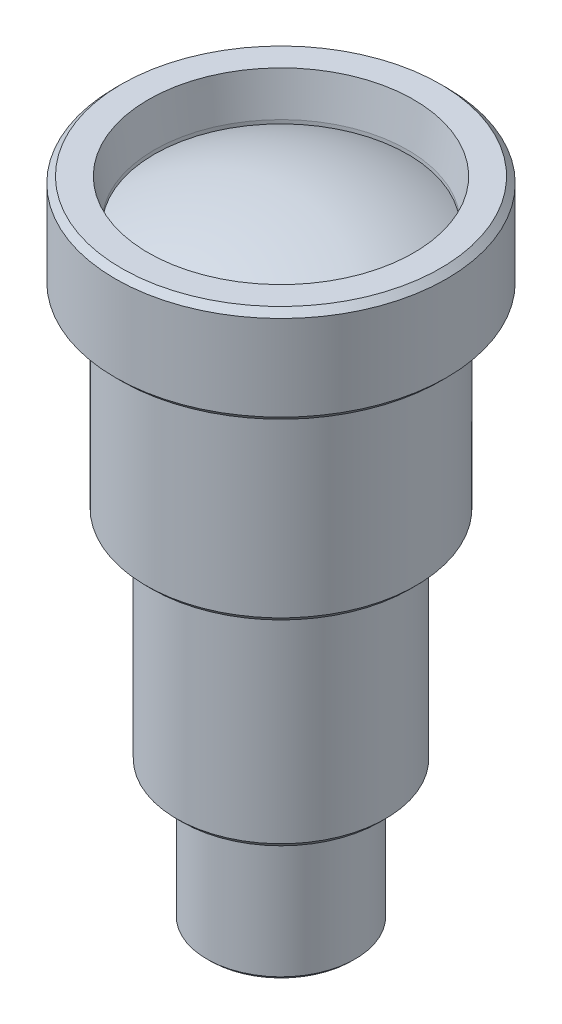
ISO-10303-21;
HEADER;
FILE_DESCRIPTION(('STEP AP214'),'2;1');
FILE_NAME('part.step','',(''),(''),'','','');
FILE_SCHEMA(('AUTOMOTIVE_DESIGN { 1 0 10303 214 1 1 1 1 }'));
ENDSEC;
DATA;
#1=APPLICATION_CONTEXT('core data for automotive mechanical design processes');
#2=APPLICATION_PROTOCOL_DEFINITION('international standard','automotive_design',2000,#1);
#3=PRODUCT_CONTEXT('',#1,'mechanical');
#4=PRODUCT('Part','Part','',(#3));
#5=PRODUCT_RELATED_PRODUCT_CATEGORY('part','',(#4));
#6=PRODUCT_DEFINITION_FORMATION('','',#4);
#7=PRODUCT_DEFINITION_CONTEXT('part definition',#1,'design');
#8=PRODUCT_DEFINITION('design','',#6,#7);
#9=PRODUCT_DEFINITION_SHAPE('','',#8);
#10=(LENGTH_UNIT() NAMED_UNIT(*) SI_UNIT(.MILLI.,.METRE.));
#11=(NAMED_UNIT(*) PLANE_ANGLE_UNIT() SI_UNIT($,.RADIAN.));
#12=(NAMED_UNIT(*) SI_UNIT($,.STERADIAN.) SOLID_ANGLE_UNIT());
#13=UNCERTAINTY_MEASURE_WITH_UNIT(LENGTH_MEASURE(1.E-05),#10,'distance_accuracy_value','');
#14=(GEOMETRIC_REPRESENTATION_CONTEXT(3) GLOBAL_UNCERTAINTY_ASSIGNED_CONTEXT((#13)) GLOBAL_UNIT_ASSIGNED_CONTEXT((#10,
#11,#12)) REPRESENTATION_CONTEXT('',''));
#15=CARTESIAN_POINT('',(0.,0.,0.));
#16=DIRECTION('',(0.,0.,1.));
#17=DIRECTION('',(1.,0.,0.));
#18=AXIS2_PLACEMENT_3D('',#15,#16,#17);
#19=CARTESIAN_POINT('',(49.7963038831455,120.776144187179,0.));
#20=DIRECTION('',(0.,1.,0.));
#21=DIRECTION('',(-1.,0.,0.));
#22=AXIS2_PLACEMENT_3D('',#19,#20,#21);
#23=CYLINDRICAL_SURFACE('',#22,10.3656198091898);
#24=CARTESIAN_POINT('',(49.7963038831455,118.146601070741,0.));
#25=DIRECTION('',(0.,1.,0.));
#26=DIRECTION('',(-1.,0.,0.));
#27=AXIS2_PLACEMENT_3D('',#24,#25,#26);
#28=CIRCLE('',#27,10.3656198091898);
#29=CARTESIAN_POINT('',(39.4306840739557,118.146601070741,0.));
#30=VERTEX_POINT('',#29);
#31=EDGE_CURVE('E11',#30,#30,#28,.T.);
#32=ORIENTED_EDGE('',*,*,#31,.F.);
#33=EDGE_LOOP('',(#32));
#34=FACE_BOUND('',#33,.T.);
#35=CARTESIAN_POINT('',(49.7963038831455,118.453284536166,0.));
#36=DIRECTION('',(0.,1.,0.));
#37=DIRECTION('',(-1.,0.,0.));
#38=AXIS2_PLACEMENT_3D('',#35,#36,#37);
#39=CIRCLE('',#38,10.3656198091898);
#40=CARTESIAN_POINT('',(39.4306840739557,118.453284536166,0.));
#41=VERTEX_POINT('',#40);
#42=EDGE_CURVE('E44',#41,#41,#39,.T.);
#43=ORIENTED_EDGE('',*,*,#42,.T.);
#44=EDGE_LOOP('',(#43));
#45=FACE_BOUND('',#44,.T.);
#46=ADVANCED_FACE('F38',(#34,#45),#23,.F.);
#47=CARTESIAN_POINT('',(49.7963038831455,118.453284536166,0.));
#48=DIRECTION('',(0.,1.,0.));
#49=DIRECTION('',(-1.,0.,0.));
#50=AXIS2_PLACEMENT_3D('',#47,#48,#49);
#51=CONICAL_SURFACE('',#50,10.3656198091898,0.150006778663949);
#52=CARTESIAN_POINT('',(49.7963038831455,121.764275545283,0.));
#53=DIRECTION('',(0.,1.,0.));
#54=DIRECTION('',(-1.,0.,0.));
#55=AXIS2_PLACEMENT_3D('',#52,#53,#54);
#56=CIRCLE('',#55,10.8660501141254);
#57=CARTESIAN_POINT('',(38.9302537690202,121.764275545283,0.));
#58=VERTEX_POINT('',#57);
#59=EDGE_CURVE('E140',#58,#58,#56,.T.);
#60=ORIENTED_EDGE('',*,*,#59,.T.);
#61=EDGE_LOOP('',(#60));
#62=FACE_BOUND('',#61,.T.);
#63=ORIENTED_EDGE('',*,*,#42,.F.);
#64=EDGE_LOOP('',(#63));
#65=FACE_BOUND('',#64,.T.);
#66=ADVANCED_FACE('F146',(#62,#65),#51,.F.);
#67=CARTESIAN_POINT('',(24.7494361644933,121.764275545283,0.));
#68=DIRECTION('',(0.,1.,0.));
#69=DIRECTION('',(-1.,0.,0.));
#70=AXIS2_PLACEMENT_3D('',#67,#68,#69);
#71=PLANE('',#70);
#72=CARTESIAN_POINT('',(49.7963038831455,121.764275545283,0.));
#73=DIRECTION('',(0.,1.,0.));
#74=DIRECTION('',(-1.,0.,0.));
#75=AXIS2_PLACEMENT_3D('',#72,#73,#74);
#76=CIRCLE('',#75,13.0591025630408);
#77=CARTESIAN_POINT('',(36.7372013201047,121.764275545283,0.));
#78=VERTEX_POINT('',#77);
#79=EDGE_CURVE('E137',#78,#78,#76,.T.);
#80=ORIENTED_EDGE('',*,*,#79,.T.);
#81=EDGE_LOOP('',(#80));
#82=FACE_BOUND('',#81,.T.);
#83=ORIENTED_EDGE('',*,*,#59,.F.);
#84=EDGE_LOOP('',(#83));
#85=FACE_BOUND('',#84,.T.);
#86=ADVANCED_FACE('F148',(#82,#85),#71,.T.);
#87=CARTESIAN_POINT('',(49.7963038831455,121.764275545283,0.));
#88=DIRECTION('',(0.,-1.,0.));
#89=DIRECTION('',(1.,0.,0.));
#90=AXIS2_PLACEMENT_3D('',#87,#88,#89);
#91=CONICAL_SURFACE('',#90,13.0591025630408,0.785283295687259);
#92=CARTESIAN_POINT('',(49.7963038831455,121.263717481781,0.));
#93=DIRECTION('',(0.,1.,0.));
#94=DIRECTION('',(-1.,0.,0.));
#95=AXIS2_PLACEMENT_3D('',#92,#93,#94);
#96=CIRCLE('',#95,13.559545643833);
#97=CARTESIAN_POINT('',(36.2367582393125,121.263717481781,0.));
#98=VERTEX_POINT('',#97);
#99=EDGE_CURVE('E134',#98,#98,#96,.T.);
#100=ORIENTED_EDGE('',*,*,#99,.T.);
#101=EDGE_LOOP('',(#100));
#102=FACE_BOUND('',#101,.T.);
#103=ORIENTED_EDGE('',*,*,#79,.F.);
#104=EDGE_LOOP('',(#103));
#105=FACE_BOUND('',#104,.T.);
#106=ADVANCED_FACE('F154',(#102,#105),#91,.T.);
#107=CARTESIAN_POINT('',(49.7963038831455,120.776144187179,0.));
#108=DIRECTION('',(0.,1.,0.));
#109=DIRECTION('',(-1.,0.,0.));
#110=AXIS2_PLACEMENT_3D('',#107,#108,#109);
#111=CYLINDRICAL_SURFACE('',#110,13.559545643833);
#112=CARTESIAN_POINT('',(49.7963038831455,114.268808207967,0.));
#113=DIRECTION('',(0.,1.,0.));
#114=DIRECTION('',(-1.,0.,0.));
#115=AXIS2_PLACEMENT_3D('',#112,#113,#114);
#116=CIRCLE('',#115,13.559545643833);
#117=CARTESIAN_POINT('',(36.2367582393125,114.268808207967,0.));
#118=VERTEX_POINT('',#117);
#119=EDGE_CURVE('E131',#118,#118,#116,.T.);
#120=ORIENTED_EDGE('',*,*,#119,.T.);
#121=EDGE_LOOP('',(#120));
#122=FACE_BOUND('',#121,.T.);
#123=ORIENTED_EDGE('',*,*,#99,.F.);
#124=EDGE_LOOP('',(#123));
#125=FACE_BOUND('',#124,.T.);
#126=ADVANCED_FACE('F161',(#122,#125),#111,.T.);
#127=CARTESIAN_POINT('',(49.7963038831455,114.268808207967,0.));
#128=DIRECTION('',(0.,1.,0.));
#129=DIRECTION('',(-1.,0.,0.));
#130=AXIS2_PLACEMENT_3D('',#127,#128,#129);
#131=CONICAL_SURFACE('',#130,13.559545643833,0.785283295687283);
#132=CARTESIAN_POINT('',(49.7963038831455,113.768250144465,0.));
#133=DIRECTION('',(0.,1.,0.));
#134=DIRECTION('',(-1.,0.,0.));
#135=AXIS2_PLACEMENT_3D('',#132,#133,#134);
#136=CIRCLE('',#135,13.0591025630408);
#137=CARTESIAN_POINT('',(36.7372013201047,113.768250144465,0.));
#138=VERTEX_POINT('',#137);
#139=EDGE_CURVE('E128',#138,#138,#136,.T.);
#140=ORIENTED_EDGE('',*,*,#139,.T.);
#141=EDGE_LOOP('',(#140));
#142=FACE_BOUND('',#141,.T.);
#143=ORIENTED_EDGE('',*,*,#119,.F.);
#144=EDGE_LOOP('',(#143));
#145=FACE_BOUND('',#144,.T.);
#146=ADVANCED_FACE('F165',(#142,#145),#131,.T.);
#147=CARTESIAN_POINT('',(24.7494361644933,113.768250144465,0.));
#148=DIRECTION('',(0.,-1.,0.));
#149=DIRECTION('',(1.,0.,0.));
#150=AXIS2_PLACEMENT_3D('',#147,#148,#149);
#151=PLANE('',#150);
#152=CARTESIAN_POINT('',(49.7963038831455,113.768250144465,0.));
#153=DIRECTION('',(0.,1.,0.));
#154=DIRECTION('',(-1.,0.,0.));
#155=AXIS2_PLACEMENT_3D('',#152,#153,#154);
#156=CIRCLE('',#155,12.1649714596142);
#157=CARTESIAN_POINT('',(37.6313324235313,113.768250144465,0.));
#158=VERTEX_POINT('',#157);
#159=EDGE_CURVE('E125',#158,#158,#156,.T.);
#160=ORIENTED_EDGE('',*,*,#159,.T.);
#161=EDGE_LOOP('',(#160));
#162=FACE_BOUND('',#161,.T.);
#163=ORIENTED_EDGE('',*,*,#139,.F.);
#164=EDGE_LOOP('',(#163));
#165=FACE_BOUND('',#164,.T.);
#166=ADVANCED_FACE('F169',(#162,#165),#151,.T.);
#167=CARTESIAN_POINT('',(49.7963038831455,120.776144187179,0.));
#168=DIRECTION('',(0.,1.,0.));
#169=DIRECTION('',(-1.,0.,0.));
#170=AXIS2_PLACEMENT_3D('',#167,#168,#169);
#171=CYLINDRICAL_SURFACE('',#170,12.1649714596142);
#172=ORIENTED_EDGE('',*,*,#159,.F.);
#173=EDGE_LOOP('',(#172));
#174=FACE_BOUND('',#173,.T.);
#175=CARTESIAN_POINT('',(49.7963038831455,118.154457249149,0.));
#176=DIRECTION('',(0.,1.,0.));
#177=DIRECTION('',(-1.,0.,0.));
#178=AXIS2_PLACEMENT_3D('',#175,#176,#177);
#179=CIRCLE('',#178,12.1649714596142);
#180=CARTESIAN_POINT('',(37.6313324235313,118.154457249149,0.));
#181=VERTEX_POINT('',#180);
#182=EDGE_CURVE('E122',#181,#181,#179,.T.);
#183=ORIENTED_EDGE('',*,*,#182,.T.);
#184=EDGE_LOOP('',(#183));
#185=FACE_BOUND('',#184,.T.);
#186=ADVANCED_FACE('F173',(#174,#185),#171,.F.);
#187=CARTESIAN_POINT('',(24.7494361644933,118.154457249149,0.));
#188=DIRECTION('',(0.,-1.,0.));
#189=DIRECTION('',(1.,0.,0.));
#190=AXIS2_PLACEMENT_3D('',#187,#188,#189);
#191=PLANE('',#190);
#192=CARTESIAN_POINT('',(49.7963038831455,118.154457249149,0.));
#193=DIRECTION('',(0.,1.,0.));
#194=DIRECTION('',(-1.,0.,0.));
#195=AXIS2_PLACEMENT_3D('',#192,#193,#194);
#196=CIRCLE('',#195,11.6645411546787);
#197=CARTESIAN_POINT('',(38.1317627284669,118.154457249149,0.));
#198=VERTEX_POINT('',#197);
#199=EDGE_CURVE('E119',#198,#198,#196,.T.);
#200=ORIENTED_EDGE('',*,*,#199,.T.);
#201=EDGE_LOOP('',(#200));
#202=FACE_BOUND('',#201,.T.);
#203=ORIENTED_EDGE('',*,*,#182,.F.);
#204=EDGE_LOOP('',(#203));
#205=FACE_BOUND('',#204,.T.);
#206=ADVANCED_FACE('F177',(#202,#205),#191,.T.);
#207=CARTESIAN_POINT('',(49.7963038831455,120.776144187179,0.));
#208=DIRECTION('',(0.,1.,0.));
#209=DIRECTION('',(-1.,0.,0.));
#210=AXIS2_PLACEMENT_3D('',#207,#208,#209);
#211=CYLINDRICAL_SURFACE('',#210,11.6645411546787);
#212=CARTESIAN_POINT('',(49.7963038831455,114.290271647137,0.));
#213=DIRECTION('',(0.,1.,0.));
#214=DIRECTION('',(-1.,0.,0.));
#215=AXIS2_PLACEMENT_3D('',#212,#213,#214);
#216=CIRCLE('',#215,11.6645411546787);
#217=CARTESIAN_POINT('',(38.1317627284669,114.290271647137,0.));
#218=VERTEX_POINT('',#217);
#219=EDGE_CURVE('E116',#218,#218,#216,.T.);
#220=ORIENTED_EDGE('',*,*,#219,.T.);
#221=EDGE_LOOP('',(#220));
#222=FACE_BOUND('',#221,.T.);
#223=ORIENTED_EDGE('',*,*,#199,.F.);
#224=EDGE_LOOP('',(#223));
#225=FACE_BOUND('',#224,.T.);
#226=ADVANCED_FACE('F181',(#222,#225),#211,.T.);
#227=CARTESIAN_POINT('',(49.7963038831455,114.290271647137,0.));
#228=DIRECTION('',(0.,1.,0.));
#229=DIRECTION('',(-1.,0.,0.));
#230=AXIS2_PLACEMENT_3D('',#227,#228,#229);
#231=CONICAL_SURFACE('',#230,11.6645411546787,0.958673813778408);
#232=CARTESIAN_POINT('',(49.7963038831455,113.863941310765,0.));
#233=DIRECTION('',(0.,1.,0.));
#234=DIRECTION('',(-1.,0.,0.));
#235=AXIS2_PLACEMENT_3D('',#232,#233,#234);
#236=CIRCLE('',#235,11.0573046881587);
#237=CARTESIAN_POINT('',(38.7389991949868,113.863941310765,0.));
#238=VERTEX_POINT('',#237);
#239=EDGE_CURVE('E113',#238,#238,#236,.T.);
#240=ORIENTED_EDGE('',*,*,#239,.T.);
#241=EDGE_LOOP('',(#240));
#242=FACE_BOUND('',#241,.T.);
#243=ORIENTED_EDGE('',*,*,#219,.F.);
#244=EDGE_LOOP('',(#243));
#245=FACE_BOUND('',#244,.T.);
#246=ADVANCED_FACE('F185',(#242,#245),#231,.T.);
#247=CARTESIAN_POINT('',(49.7963038831455,120.776144187179,0.));
#248=DIRECTION('',(0.,1.,0.));
#249=DIRECTION('',(-1.,0.,0.));
#250=AXIS2_PLACEMENT_3D('',#247,#248,#249);
#251=CYLINDRICAL_SURFACE('',#250,11.0573046881587);
#252=CARTESIAN_POINT('',(49.7963038831455,98.2670477552795,0.));
#253=DIRECTION('',(0.,1.,0.));
#254=DIRECTION('',(-1.,0.,0.));
#255=AXIS2_PLACEMENT_3D('',#252,#253,#254);
#256=CIRCLE('',#255,11.0573046881587);
#257=CARTESIAN_POINT('',(38.7389991949868,98.2670477552795,0.));
#258=VERTEX_POINT('',#257);
#259=EDGE_CURVE('E110',#258,#258,#256,.T.);
#260=ORIENTED_EDGE('',*,*,#259,.T.);
#261=EDGE_LOOP('',(#260));
#262=FACE_BOUND('',#261,.T.);
#263=ORIENTED_EDGE('',*,*,#239,.F.);
#264=EDGE_LOOP('',(#263));
#265=FACE_BOUND('',#264,.T.);
#266=ADVANCED_FACE('F189',(#262,#265),#251,.T.);
#267=CARTESIAN_POINT('',(49.7963038831455,98.2670477552795,0.));
#268=DIRECTION('',(0.,1.,0.));
#269=DIRECTION('',(-1.,0.,0.));
#270=AXIS2_PLACEMENT_3D('',#267,#268,#269);
#271=CONICAL_SURFACE('',#270,11.0573046881587,0.785398163397448);
#272=CARTESIAN_POINT('',(49.7963038831455,97.766617450344,0.));
#273=DIRECTION('',(0.,1.,0.));
#274=DIRECTION('',(-1.,0.,0.));
#275=AXIS2_PLACEMENT_3D('',#272,#273,#274);
#276=CIRCLE('',#275,10.5568743832231);
#277=CARTESIAN_POINT('',(39.2394294999224,97.766617450344,0.));
#278=VERTEX_POINT('',#277);
#279=EDGE_CURVE('E107',#278,#278,#276,.T.);
#280=ORIENTED_EDGE('',*,*,#279,.T.);
#281=EDGE_LOOP('',(#280));
#282=FACE_BOUND('',#281,.T.);
#283=ORIENTED_EDGE('',*,*,#259,.F.);
#284=EDGE_LOOP('',(#283));
#285=FACE_BOUND('',#284,.T.);
#286=ADVANCED_FACE('F193',(#282,#285),#271,.T.);
#287=CARTESIAN_POINT('',(24.7494361644933,97.766617450344,0.));
#288=DIRECTION('',(0.,1.,0.));
#289=DIRECTION('',(-1.,0.,0.));
#290=AXIS2_PLACEMENT_3D('',#287,#288,#289);
#291=PLANE('',#290);
#292=ORIENTED_EDGE('',*,*,#279,.F.);
#293=EDGE_LOOP('',(#292));
#294=FACE_BOUND('',#293,.T.);
#295=CARTESIAN_POINT('',(49.7963038831455,97.766617450344,0.));
#296=DIRECTION('',(0.,1.,0.));
#297=DIRECTION('',(-1.,0.,0.));
#298=AXIS2_PLACEMENT_3D('',#295,#296,#297);
#299=CIRCLE('',#298,8.55579195631336);
#300=CARTESIAN_POINT('',(41.2405119268322,97.766617450344,0.));
#301=VERTEX_POINT('',#300);
#302=EDGE_CURVE('E104',#301,#301,#299,.T.);
#303=ORIENTED_EDGE('',*,*,#302,.T.);
#304=EDGE_LOOP('',(#303));
#305=FACE_BOUND('',#304,.T.);
#306=ADVANCED_FACE('F197',(#294,#305),#291,.F.);
#307=CARTESIAN_POINT('',(49.7963038831455,120.776144187179,0.));
#308=DIRECTION('',(0.,1.,0.));
#309=DIRECTION('',(-1.,0.,0.));
#310=AXIS2_PLACEMENT_3D('',#307,#308,#309);
#311=CYLINDRICAL_SURFACE('',#310,8.55579195631336);
#312=ORIENTED_EDGE('',*,*,#302,.F.);
#313=EDGE_LOOP('',(#312));
#314=FACE_BOUND('',#313,.T.);
#315=CARTESIAN_POINT('',(49.7963038831455,80.4875268499039,0.));
#316=DIRECTION('',(0.,1.,0.));
#317=DIRECTION('',(-1.,0.,0.));
#318=AXIS2_PLACEMENT_3D('',#315,#316,#317);
#319=CIRCLE('',#318,8.55579195631336);
#320=CARTESIAN_POINT('',(41.2405119268322,80.4875268499039,0.));
#321=VERTEX_POINT('',#320);
#322=EDGE_CURVE('E101',#321,#321,#319,.T.);
#323=ORIENTED_EDGE('',*,*,#322,.T.);
#324=EDGE_LOOP('',(#323));
#325=FACE_BOUND('',#324,.T.);
#326=ADVANCED_FACE('F201',(#314,#325),#311,.T.);
#327=CARTESIAN_POINT('',(49.7963038831455,80.4875268499039,0.));
#328=DIRECTION('',(0.,1.,0.));
#329=DIRECTION('',(-1.,0.,0.));
#330=AXIS2_PLACEMENT_3D('',#327,#328,#329);
#331=CONICAL_SURFACE('',#330,8.55579195631336,0.785270530979511);
#332=CARTESIAN_POINT('',(49.7963038831455,79.9869687864018,0.));
#333=DIRECTION('',(0.,1.,0.));
#334=DIRECTION('',(-1.,0.,0.));
#335=AXIS2_PLACEMENT_3D('',#332,#333,#334);
#336=CIRCLE('',#335,8.0553616513778);
#337=CARTESIAN_POINT('',(41.7409422317677,79.9869687864018,0.));
#338=VERTEX_POINT('',#337);
#339=EDGE_CURVE('E98',#338,#338,#336,.T.);
#340=ORIENTED_EDGE('',*,*,#339,.T.);
#341=EDGE_LOOP('',(#340));
#342=FACE_BOUND('',#341,.T.);
#343=ORIENTED_EDGE('',*,*,#322,.F.);
#344=EDGE_LOOP('',(#343));
#345=FACE_BOUND('',#344,.T.);
#346=ADVANCED_FACE('F205',(#342,#345),#331,.T.);
#347=CARTESIAN_POINT('',(24.7494361644933,79.9869687864018,0.));
#348=DIRECTION('',(0.,-1.,0.));
#349=DIRECTION('',(1.,0.,0.));
#350=AXIS2_PLACEMENT_3D('',#347,#348,#349);
#351=PLANE('',#350);
#352=CARTESIAN_POINT('',(49.7963038831455,79.9869687864018,0.));
#353=DIRECTION('',(0.,1.,0.));
#354=DIRECTION('',(-1.,0.,0.));
#355=AXIS2_PLACEMENT_3D('',#352,#353,#354);
#356=CIRCLE('',#355,5.60648544892575);
#357=CARTESIAN_POINT('',(44.1898184342198,79.9869687864018,0.));
#358=VERTEX_POINT('',#357);
#359=EDGE_CURVE('E95',#358,#358,#356,.T.);
#360=ORIENTED_EDGE('',*,*,#359,.T.);
#361=EDGE_LOOP('',(#360));
#362=FACE_BOUND('',#361,.T.);
#363=ORIENTED_EDGE('',*,*,#339,.F.);
#364=EDGE_LOOP('',(#363));
#365=FACE_BOUND('',#364,.T.);
#366=ADVANCED_FACE('F209',(#362,#365),#351,.T.);
#367=CARTESIAN_POINT('',(49.7963038831455,120.776144187179,0.));
#368=DIRECTION('',(0.,1.,0.));
#369=DIRECTION('',(-1.,0.,0.));
#370=AXIS2_PLACEMENT_3D('',#367,#368,#369);
#371=CYLINDRICAL_SURFACE('',#370,5.60648544892575);
#372=CARTESIAN_POINT('',(49.7963038831455,79.1884777458485,0.));
#373=DIRECTION('',(0.,1.,0.));
#374=DIRECTION('',(-1.,0.,0.));
#375=AXIS2_PLACEMENT_3D('',#372,#373,#374);
#376=CIRCLE('',#375,5.60648544892575);
#377=CARTESIAN_POINT('',(44.1898184342198,79.1884777458485,0.));
#378=VERTEX_POINT('',#377);
#379=EDGE_CURVE('E92',#378,#378,#376,.T.);
#380=ORIENTED_EDGE('',*,*,#379,.T.);
#381=EDGE_LOOP('',(#380));
#382=FACE_BOUND('',#381,.T.);
#383=ORIENTED_EDGE('',*,*,#359,.F.);
#384=EDGE_LOOP('',(#383));
#385=FACE_BOUND('',#384,.T.);
#386=ADVANCED_FACE('F213',(#382,#385),#371,.T.);
#387=CARTESIAN_POINT('',(24.7494361644933,79.1884777458485,0.));
#388=DIRECTION('',(0.,1.,0.));
#389=DIRECTION('',(-1.,0.,0.));
#390=AXIS2_PLACEMENT_3D('',#387,#388,#389);
#391=PLANE('',#390);
#392=CARTESIAN_POINT('',(49.7963038831455,79.1884777458485,0.));
#393=DIRECTION('',(0.,1.,0.));
#394=DIRECTION('',(-1.,0.,0.));
#395=AXIS2_PLACEMENT_3D('',#392,#393,#394);
#396=CIRCLE('',#395,5.75545193745137);
#397=CARTESIAN_POINT('',(44.0408519456942,79.1884777458485,0.));
#398=VERTEX_POINT('',#397);
#399=EDGE_CURVE('E89',#398,#398,#396,.T.);
#400=ORIENTED_EDGE('',*,*,#399,.T.);
#401=EDGE_LOOP('',(#400));
#402=FACE_BOUND('',#401,.T.);
#403=ORIENTED_EDGE('',*,*,#379,.F.);
#404=EDGE_LOOP('',(#403));
#405=FACE_BOUND('',#404,.T.);
#406=ADVANCED_FACE('F217',(#402,#405),#391,.T.);
#407=CARTESIAN_POINT('',(49.7963038831455,79.1884777458485,0.));
#408=DIRECTION('',(0.,-1.,0.));
#409=DIRECTION('',(1.,0.,0.));
#410=AXIS2_PLACEMENT_3D('',#407,#408,#409);
#411=CONICAL_SURFACE('',#410,5.75545193745137,0.803087977590895);
#412=CARTESIAN_POINT('',(49.7963038831455,78.8905447687973,0.));
#413=DIRECTION('',(0.,1.,0.));
#414=DIRECTION('',(-1.,0.,0.));
#415=AXIS2_PLACEMENT_3D('',#412,#413,#414);
#416=CIRCLE('',#415,6.06411663408764);
#417=CARTESIAN_POINT('',(43.7321872490579,78.8905447687973,0.));
#418=VERTEX_POINT('',#417);
#419=EDGE_CURVE('E86',#418,#418,#416,.T.);
#420=ORIENTED_EDGE('',*,*,#419,.T.);
#421=EDGE_LOOP('',(#420));
#422=FACE_BOUND('',#421,.T.);
#423=ORIENTED_EDGE('',*,*,#399,.F.);
#424=EDGE_LOOP('',(#423));
#425=FACE_BOUND('',#424,.T.);
#426=ADVANCED_FACE('F221',(#422,#425),#411,.T.);
#427=CARTESIAN_POINT('',(49.7963038831455,120.776144187179,0.));
#428=DIRECTION('',(0.,1.,0.));
#429=DIRECTION('',(-1.,0.,0.));
#430=AXIS2_PLACEMENT_3D('',#427,#428,#429);
#431=CYLINDRICAL_SURFACE('',#430,6.06411663408764);
#432=CARTESIAN_POINT('',(49.7963038831455,69.2870610844213,0.));
#433=DIRECTION('',(0.,1.,0.));
#434=DIRECTION('',(-1.,0.,0.));
#435=AXIS2_PLACEMENT_3D('',#432,#433,#434);
#436=CIRCLE('',#435,6.06411663408764);
#437=CARTESIAN_POINT('',(43.7321872490579,69.2870610844213,0.));
#438=VERTEX_POINT('',#437);
#439=EDGE_CURVE('E83',#438,#438,#436,.T.);
#440=ORIENTED_EDGE('',*,*,#439,.T.);
#441=EDGE_LOOP('',(#440));
#442=FACE_BOUND('',#441,.T.);
#443=ORIENTED_EDGE('',*,*,#419,.F.);
#444=EDGE_LOOP('',(#443));
#445=FACE_BOUND('',#444,.T.);
#446=ADVANCED_FACE('F225',(#442,#445),#431,.T.);
#447=CARTESIAN_POINT('',(49.7963038831455,69.2870610844213,0.));
#448=DIRECTION('',(0.,1.,0.));
#449=DIRECTION('',(-1.,0.,0.));
#450=AXIS2_PLACEMENT_3D('',#447,#448,#449);
#451=CONICAL_SURFACE('',#450,6.06411663408765,0.802873747844111);
#452=CARTESIAN_POINT('',(49.7963038831455,68.9890003488036,0.));
#453=DIRECTION('',(0.,1.,0.));
#454=DIRECTION('',(-1.,0.,0.));
#455=AXIS2_PLACEMENT_3D('',#452,#453,#454);
#456=CIRCLE('',#455,5.75545193745137);
#457=CARTESIAN_POINT('',(44.0408519456942,68.9890003488036,0.));
#458=VERTEX_POINT('',#457);
#459=EDGE_CURVE('E80',#458,#458,#456,.T.);
#460=ORIENTED_EDGE('',*,*,#459,.T.);
#461=EDGE_LOOP('',(#460));
#462=FACE_BOUND('',#461,.T.);
#463=ORIENTED_EDGE('',*,*,#439,.F.);
#464=EDGE_LOOP('',(#463));
#465=FACE_BOUND('',#464,.T.);
#466=ADVANCED_FACE('F229',(#462,#465),#451,.T.);
#467=CARTESIAN_POINT('',(24.7494361644933,68.9890003488036,0.));
#468=DIRECTION('',(0.,-1.,0.));
#469=DIRECTION('',(1.,0.,0.));
#470=AXIS2_PLACEMENT_3D('',#467,#468,#469);
#471=PLANE('',#470);
#472=CARTESIAN_POINT('',(49.7963038831455,68.9890003488036,0.));
#473=DIRECTION('',(0.,1.,0.));
#474=DIRECTION('',(-1.,0.,0.));
#475=AXIS2_PLACEMENT_3D('',#472,#473,#474);
#476=CIRCLE('',#475,5.10605514399019);
#477=CARTESIAN_POINT('',(44.6902487391553,68.9890003488036,0.));
#478=VERTEX_POINT('',#477);
#479=EDGE_CURVE('E77',#478,#478,#476,.T.);
#480=ORIENTED_EDGE('',*,*,#479,.T.);
#481=EDGE_LOOP('',(#480));
#482=FACE_BOUND('',#481,.T.);
#483=ORIENTED_EDGE('',*,*,#459,.F.);
#484=EDGE_LOOP('',(#483));
#485=FACE_BOUND('',#484,.T.);
#486=ADVANCED_FACE('F233',(#482,#485),#471,.T.);
#487=CARTESIAN_POINT('',(49.7963038831455,120.776144187179,0.));
#488=DIRECTION('',(0.,1.,0.));
#489=DIRECTION('',(-1.,0.,0.));
#490=AXIS2_PLACEMENT_3D('',#487,#488,#489);
#491=CYLINDRICAL_SURFACE('',#490,5.10605514399019);
#492=ORIENTED_EDGE('',*,*,#479,.F.);
#493=EDGE_LOOP('',(#492));
#494=FACE_BOUND('',#493,.T.);
#495=CARTESIAN_POINT('',(49.7963038831455,80.4875268499039,0.));
#496=DIRECTION('',(0.,1.,0.));
#497=DIRECTION('',(-1.,0.,0.));
#498=AXIS2_PLACEMENT_3D('',#495,#496,#497);
#499=CIRCLE('',#498,5.10605514399019);
#500=CARTESIAN_POINT('',(44.6902487391553,80.4875268499039,0.));
#501=VERTEX_POINT('',#500);
#502=EDGE_CURVE('E74',#501,#501,#499,.T.);
#503=ORIENTED_EDGE('',*,*,#502,.T.);
#504=EDGE_LOOP('',(#503));
#505=FACE_BOUND('',#504,.T.);
#506=ADVANCED_FACE('F237',(#494,#505),#491,.F.);
#507=CARTESIAN_POINT('',(24.7494361644933,80.4875268499039,0.));
#508=DIRECTION('',(0.,-1.,0.));
#509=DIRECTION('',(1.,0.,0.));
#510=AXIS2_PLACEMENT_3D('',#507,#508,#509);
#511=PLANE('',#510);
#512=ORIENTED_EDGE('',*,*,#502,.F.);
#513=EDGE_LOOP('',(#512));
#514=FACE_BOUND('',#513,.T.);
#515=CARTESIAN_POINT('',(49.7963038831455,80.4875268499039,0.));
#516=DIRECTION('',(0.,1.,0.));
#517=DIRECTION('',(-1.,0.,0.));
#518=AXIS2_PLACEMENT_3D('',#515,#516,#517);
#519=CIRCLE('',#518,7.55493134644225);
#520=CARTESIAN_POINT('',(42.2413725367033,80.4875268499039,0.));
#521=VERTEX_POINT('',#520);
#522=EDGE_CURVE('E71',#521,#521,#519,.T.);
#523=ORIENTED_EDGE('',*,*,#522,.T.);
#524=EDGE_LOOP('',(#523));
#525=FACE_BOUND('',#524,.T.);
#526=ADVANCED_FACE('F241',(#514,#525),#511,.F.);
#527=CARTESIAN_POINT('',(49.7963038831455,120.776144187179,0.));
#528=DIRECTION('',(0.,1.,0.));
#529=DIRECTION('',(-1.,0.,0.));
#530=AXIS2_PLACEMENT_3D('',#527,#528,#529);
#531=CYLINDRICAL_SURFACE('',#530,7.55493134644225);
#532=ORIENTED_EDGE('',*,*,#522,.F.);
#533=EDGE_LOOP('',(#532));
#534=FACE_BOUND('',#533,.T.);
#535=CARTESIAN_POINT('',(49.7963038831455,99.4065264097907,0.));
#536=DIRECTION('',(0.,1.,0.));
#537=DIRECTION('',(-1.,0.,0.));
#538=AXIS2_PLACEMENT_3D('',#535,#536,#537);
#539=CIRCLE('',#538,7.55493134644225);
#540=CARTESIAN_POINT('',(42.2413725367033,99.4065264097907,0.));
#541=VERTEX_POINT('',#540);
#542=EDGE_CURVE('E68',#541,#541,#539,.T.);
#543=ORIENTED_EDGE('',*,*,#542,.T.);
#544=EDGE_LOOP('',(#543));
#545=FACE_BOUND('',#544,.T.);
#546=ADVANCED_FACE('F245',(#534,#545),#531,.F.);
#547=CARTESIAN_POINT('',(24.7494361644933,99.4065264097907,0.));
#548=DIRECTION('',(0.,-1.,0.));
#549=DIRECTION('',(1.,0.,0.));
#550=AXIS2_PLACEMENT_3D('',#547,#548,#549);
#551=PLANE('',#550);
#552=ORIENTED_EDGE('',*,*,#542,.F.);
#553=EDGE_LOOP('',(#552));
#554=FACE_BOUND('',#553,.T.);
#555=CARTESIAN_POINT('',(49.7963038831455,99.4065264097907,0.));
#556=DIRECTION('',(0.,1.,0.));
#557=DIRECTION('',(-1.,0.,0.));
#558=AXIS2_PLACEMENT_3D('',#555,#556,#557);
#559=CIRCLE('',#558,9.96075291198767);
#560=CARTESIAN_POINT('',(39.8355509711579,99.4065264097907,0.));
#561=VERTEX_POINT('',#560);
#562=EDGE_CURVE('E65',#561,#561,#559,.T.);
#563=ORIENTED_EDGE('',*,*,#562,.T.);
#564=EDGE_LOOP('',(#563));
#565=FACE_BOUND('',#564,.T.);
#566=ADVANCED_FACE('F249',(#554,#565),#551,.F.);
#567=CARTESIAN_POINT('',(49.7963038831455,120.776144187179,0.));
#568=DIRECTION('',(0.,1.,0.));
#569=DIRECTION('',(-1.,0.,0.));
#570=AXIS2_PLACEMENT_3D('',#567,#568,#569);
#571=CYLINDRICAL_SURFACE('',#570,9.96075291198767);
#572=ORIENTED_EDGE('',*,*,#562,.F.);
#573=EDGE_LOOP('',(#572));
#574=FACE_BOUND('',#573,.T.);
#575=CARTESIAN_POINT('',(49.7963038831455,114.769238512903,0.));
#576=DIRECTION('',(0.,1.,0.));
#577=DIRECTION('',(-1.,0.,0.));
#578=AXIS2_PLACEMENT_3D('',#575,#576,#577);
#579=CIRCLE('',#578,9.96075291198767);
#580=CARTESIAN_POINT('',(39.8355509711579,114.769238512903,0.));
#581=VERTEX_POINT('',#580);
#582=EDGE_CURVE('E60',#581,#581,#579,.T.);
#583=ORIENTED_EDGE('',*,*,#582,.T.);
#584=EDGE_LOOP('',(#583));
#585=FACE_BOUND('',#584,.T.);
#586=ADVANCED_FACE('F253',(#574,#585),#571,.F.);
#587=CARTESIAN_POINT('',(24.7494361644933,114.769238512903,0.));
#588=DIRECTION('',(0.,-1.,0.));
#589=DIRECTION('',(1.,0.,0.));
#590=AXIS2_PLACEMENT_3D('',#587,#588,#589);
#591=PLANE('',#590);
#592=ORIENTED_EDGE('',*,*,#582,.F.);
#593=EDGE_LOOP('',(#592));
#594=FACE_BOUND('',#593,.T.);
#595=CARTESIAN_POINT('',(49.7963038831455,114.769238512903,0.));
#596=DIRECTION('',(0.,1.,0.));
#597=DIRECTION('',(-1.,0.,0.));
#598=AXIS2_PLACEMENT_3D('',#595,#596,#597);
#599=CIRCLE('',#598,10.6636805448075);
#600=CARTESIAN_POINT('',(39.132623338338,114.769238512903,0.));
#601=VERTEX_POINT('',#600);
#602=EDGE_CURVE('E57',#601,#601,#599,.T.);
#603=ORIENTED_EDGE('',*,*,#602,.T.);
#604=EDGE_LOOP('',(#603));
#605=FACE_BOUND('',#604,.T.);
#606=ADVANCED_FACE('F257',(#594,#605),#591,.F.);
#607=CARTESIAN_POINT('',(49.7963038831455,120.776144187179,0.));
#608=DIRECTION('',(0.,1.,0.));
#609=DIRECTION('',(-1.,0.,0.));
#610=AXIS2_PLACEMENT_3D('',#607,#608,#609);
#611=CYLINDRICAL_SURFACE('',#610,10.6636805448075);
#612=ORIENTED_EDGE('',*,*,#602,.F.);
#613=EDGE_LOOP('',(#612));
#614=FACE_BOUND('',#613,.T.);
#615=CARTESIAN_POINT('',(49.7963038831455,117.981943435398,0.));
#616=DIRECTION('',(0.,1.,0.));
#617=DIRECTION('',(-1.,0.,0.));
#618=AXIS2_PLACEMENT_3D('',#615,#616,#617);
#619=CIRCLE('',#618,10.6636805448075);
#620=CARTESIAN_POINT('',(39.132623338338,117.981943435398,0.));
#621=VERTEX_POINT('',#620);
#622=EDGE_CURVE('E55',#621,#621,#619,.T.);
#623=ORIENTED_EDGE('',*,*,#622,.T.);
#624=EDGE_LOOP('',(#623));
#625=FACE_BOUND('',#624,.T.);
#626=ADVANCED_FACE('F51',(#614,#625),#611,.F.);
#627=CARTESIAN_POINT('',(49.7963038831455,117.981943435398,0.));
#628=DIRECTION('',(0.,-1.,0.));
#629=DIRECTION('',(1.,0.,0.));
#630=AXIS2_PLACEMENT_3D('',#627,#628,#629);
#631=CONICAL_SURFACE('',#630,10.6636805448075,1.38850446067506);
#632=CARTESIAN_POINT('',(49.7963038831455,119.94766793936,0.));
#633=VERTEX_POINT('',#632);
#634=VERTEX_LOOP('',#633);
#635=FACE_BOUND('',#634,.T.);
#636=ORIENTED_EDGE('',*,*,#622,.F.);
#637=EDGE_LOOP('',(#636));
#638=FACE_BOUND('',#637,.T.);
#639=ADVANCED_FACE('F47',(#635,#638),#631,.F.);
#640=CARTESIAN_POINT('',(49.7963038831456,99.0308131608525,0.));
#641=DIRECTION('',(0.,1.,0.));
#642=DIRECTION('',(-1.,0.,0.));
#643=AXIS2_PLACEMENT_3D('',#640,#641,#642);
#644=SPHERICAL_SURFACE('',#643,21.7453310263266);
#645=ORIENTED_EDGE('',*,*,#31,.T.);
#646=EDGE_LOOP('',(#645));
#647=FACE_BOUND('',#646,.T.);
#648=ADVANCED_FACE('F50',(#647),#644,.T.);
#649=CLOSED_SHELL('',(#46,#66,#86,#106,#126,#146,#166,#186,#206,#226,#246,#266,#286,#306,#326,
#346,#366,#386,#406,#426,#446,#466,#486,#506,#526,#546,#566,#586,#606,#626,#639,#648));
#650=MANIFOLD_SOLID_BREP('B2',#649);
#651=ADVANCED_BREP_SHAPE_REPRESENTATION('',(#18,#650),#14);
#652=SHAPE_DEFINITION_REPRESENTATION(#9,#651);
ENDSEC;
END-ISO-10303-21;
